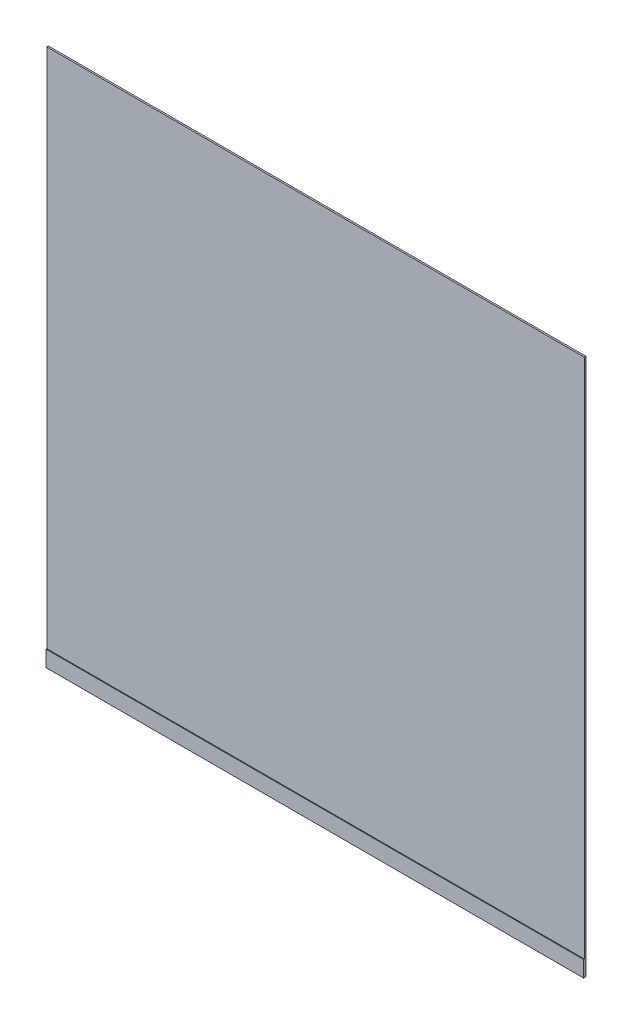
ISO-10303-21;
HEADER;
FILE_DESCRIPTION(('STEP AP214'),'2;1');
FILE_NAME('part.step','',(''),(''),'','','');
FILE_SCHEMA(('AUTOMOTIVE_DESIGN { 1 0 10303 214 1 1 1 1 }'));
ENDSEC;
DATA;
#1=APPLICATION_CONTEXT('core data for automotive mechanical design processes');
#2=APPLICATION_PROTOCOL_DEFINITION('international standard','automotive_design',2000,#1);
#3=PRODUCT_CONTEXT('',#1,'mechanical');
#4=PRODUCT('Part','Part','',(#3));
#5=PRODUCT_RELATED_PRODUCT_CATEGORY('part','',(#4));
#6=PRODUCT_DEFINITION_FORMATION('','',#4);
#7=PRODUCT_DEFINITION_CONTEXT('part definition',#1,'design');
#8=PRODUCT_DEFINITION('design','',#6,#7);
#9=PRODUCT_DEFINITION_SHAPE('','',#8);
#10=(LENGTH_UNIT() NAMED_UNIT(*) SI_UNIT(.MILLI.,.METRE.));
#11=(NAMED_UNIT(*) PLANE_ANGLE_UNIT() SI_UNIT($,.RADIAN.));
#12=(NAMED_UNIT(*) SI_UNIT($,.STERADIAN.) SOLID_ANGLE_UNIT());
#13=UNCERTAINTY_MEASURE_WITH_UNIT(LENGTH_MEASURE(1.E-05),#10,'distance_accuracy_value','');
#14=(GEOMETRIC_REPRESENTATION_CONTEXT(3) GLOBAL_UNCERTAINTY_ASSIGNED_CONTEXT((#13)) GLOBAL_UNIT_ASSIGNED_CONTEXT((#10,
#11,#12)) REPRESENTATION_CONTEXT('',''));
#15=CARTESIAN_POINT('',(0.,0.,0.));
#16=DIRECTION('',(0.,0.,1.));
#17=DIRECTION('',(1.,0.,0.));
#18=AXIS2_PLACEMENT_3D('',#15,#16,#17);
#19=CARTESIAN_POINT('',(0.,0.,10.));
#20=DIRECTION('',(0.,0.,-1.));
#21=DIRECTION('',(-1.,0.,0.));
#22=AXIS2_PLACEMENT_3D('',#19,#20,#21);
#23=PLANE('',#22);
#24=DIRECTION('',(-1.,0.,0.));
#25=VECTOR('',#24,1.);
#26=CARTESIAN_POINT('',(-1750.,-1645.26290420658,10.));
#27=LINE('',#26,#25);
#28=CARTESIAN_POINT('',(1750.,-1645.26290420658,10.));
#29=VERTEX_POINT('',#28);
#30=CARTESIAN_POINT('',(-1750.,-1645.26290420658,10.));
#31=VERTEX_POINT('',#30);
#32=EDGE_CURVE('E50',#29,#31,#27,.T.);
#33=ORIENTED_EDGE('',*,*,#32,.F.);
#34=DIRECTION('',(0.,1.,0.));
#35=VECTOR('',#34,1.);
#36=CARTESIAN_POINT('',(1750.,-1750.,10.));
#37=LINE('',#36,#35);
#38=CARTESIAN_POINT('',(1750.,1750.,10.));
#39=VERTEX_POINT('',#38);
#40=EDGE_CURVE('E88',#29,#39,#37,.T.);
#41=ORIENTED_EDGE('',*,*,#40,.T.);
#42=DIRECTION('',(-1.,0.,0.));
#43=VECTOR('',#42,1.);
#44=CARTESIAN_POINT('',(-1750.,1750.,10.));
#45=LINE('',#44,#43);
#46=CARTESIAN_POINT('',(-1750.,1750.,10.));
#47=VERTEX_POINT('',#46);
#48=EDGE_CURVE('E56',#39,#47,#45,.T.);
#49=ORIENTED_EDGE('',*,*,#48,.T.);
#50=DIRECTION('',(0.,-1.,0.));
#51=VECTOR('',#50,1.);
#52=CARTESIAN_POINT('',(-1750.,-1750.,10.));
#53=LINE('',#52,#51);
#54=EDGE_CURVE('E99',#47,#31,#53,.T.);
#55=ORIENTED_EDGE('',*,*,#54,.T.);
#56=EDGE_LOOP('',(#33,#41,#49,#55));
#57=FACE_BOUND('',#56,.T.);
#58=ADVANCED_FACE('F35',(#57),#23,.F.);
#59=CARTESIAN_POINT('',(1750.,-1750.,10.));
#60=DIRECTION('',(-1.,0.,0.));
#61=DIRECTION('',(0.,0.,1.));
#62=AXIS2_PLACEMENT_3D('',#59,#60,#61);
#63=PLANE('',#62);
#64=DIRECTION('',(0.,1.,0.));
#65=VECTOR('',#64,1.);
#66=CARTESIAN_POINT('',(1750.,-1750.,0.));
#67=LINE('',#66,#65);
#68=CARTESIAN_POINT('',(1750.,-1750.,0.));
#69=VERTEX_POINT('',#68);
#70=CARTESIAN_POINT('',(1750.,1750.,0.));
#71=VERTEX_POINT('',#70);
#72=EDGE_CURVE('E95',#69,#71,#67,.T.);
#73=ORIENTED_EDGE('',*,*,#72,.T.);
#74=DIRECTION('',(0.,0.,-1.));
#75=VECTOR('',#74,1.);
#76=CARTESIAN_POINT('',(1750.,1750.,10.));
#77=LINE('',#76,#75);
#78=EDGE_CURVE('E11',#39,#71,#77,.T.);
#79=ORIENTED_EDGE('',*,*,#78,.F.);
#80=ORIENTED_EDGE('',*,*,#40,.F.);
#81=DIRECTION('',(0.,0.,-1.));
#82=VECTOR('',#81,1.);
#83=CARTESIAN_POINT('',(1750.,-1645.26290420658,15.));
#84=LINE('',#83,#82);
#85=CARTESIAN_POINT('',(1750.,-1645.26290420658,15.));
#86=VERTEX_POINT('',#85);
#87=EDGE_CURVE('E103',#86,#29,#84,.T.);
#88=ORIENTED_EDGE('',*,*,#87,.F.);
#89=DIRECTION('',(0.,1.,0.));
#90=VECTOR('',#89,1.);
#91=CARTESIAN_POINT('',(1750.,-1750.,15.));
#92=LINE('',#91,#90);
#93=CARTESIAN_POINT('',(1750.,-1750.,15.));
#94=VERTEX_POINT('',#93);
#95=EDGE_CURVE('E98',#94,#86,#92,.T.);
#96=ORIENTED_EDGE('',*,*,#95,.F.);
#97=DIRECTION('',(0.,0.,-1.));
#98=VECTOR('',#97,1.);
#99=CARTESIAN_POINT('',(1750.,-1750.,10.));
#100=LINE('',#99,#98);
#101=EDGE_CURVE('E81',#94,#69,#100,.T.);
#102=ORIENTED_EDGE('',*,*,#101,.T.);
#103=EDGE_LOOP('',(#73,#79,#80,#88,#96,#102));
#104=FACE_BOUND('',#103,.T.);
#105=ADVANCED_FACE('F37',(#104),#63,.F.);
#106=CARTESIAN_POINT('',(-1750.,1750.,10.));
#107=DIRECTION('',(0.,-1.,0.));
#108=DIRECTION('',(0.,0.,-1.));
#109=AXIS2_PLACEMENT_3D('',#106,#107,#108);
#110=PLANE('',#109);
#111=DIRECTION('',(-1.,0.,0.));
#112=VECTOR('',#111,1.);
#113=CARTESIAN_POINT('',(-1750.,1750.,0.));
#114=LINE('',#113,#112);
#115=CARTESIAN_POINT('',(-1750.,1750.,0.));
#116=VERTEX_POINT('',#115);
#117=EDGE_CURVE('E102',#71,#116,#114,.T.);
#118=ORIENTED_EDGE('',*,*,#117,.T.);
#119=DIRECTION('',(0.,0.,-1.));
#120=VECTOR('',#119,1.);
#121=CARTESIAN_POINT('',(-1750.,1750.,10.));
#122=LINE('',#121,#120);
#123=EDGE_CURVE('E43',#47,#116,#122,.T.);
#124=ORIENTED_EDGE('',*,*,#123,.F.);
#125=ORIENTED_EDGE('',*,*,#48,.F.);
#126=ORIENTED_EDGE('',*,*,#78,.T.);
#127=EDGE_LOOP('',(#118,#124,#125,#126));
#128=FACE_BOUND('',#127,.T.);
#129=ADVANCED_FACE('F119',(#128),#110,.F.);
#130=CARTESIAN_POINT('',(-1750.,-1750.,10.));
#131=DIRECTION('',(1.,0.,0.));
#132=DIRECTION('',(0.,0.,-1.));
#133=AXIS2_PLACEMENT_3D('',#130,#131,#132);
#134=PLANE('',#133);
#135=DIRECTION('',(0.,-1.,0.));
#136=VECTOR('',#135,1.);
#137=CARTESIAN_POINT('',(-1750.,-1750.,0.));
#138=LINE('',#137,#136);
#139=CARTESIAN_POINT('',(-1750.,-1750.,0.));
#140=VERTEX_POINT('',#139);
#141=EDGE_CURVE('E89',#116,#140,#138,.T.);
#142=ORIENTED_EDGE('',*,*,#141,.T.);
#143=DIRECTION('',(0.,0.,-1.));
#144=VECTOR('',#143,1.);
#145=CARTESIAN_POINT('',(-1750.,-1750.,10.));
#146=LINE('',#145,#144);
#147=CARTESIAN_POINT('',(-1750.,-1750.,15.));
#148=VERTEX_POINT('',#147);
#149=EDGE_CURVE('E84',#148,#140,#146,.T.);
#150=ORIENTED_EDGE('',*,*,#149,.F.);
#151=DIRECTION('',(0.,-1.,0.));
#152=VECTOR('',#151,1.);
#153=CARTESIAN_POINT('',(-1750.,-1750.,15.));
#154=LINE('',#153,#152);
#155=CARTESIAN_POINT('',(-1750.,-1645.26290420658,15.));
#156=VERTEX_POINT('',#155);
#157=EDGE_CURVE('E139',#156,#148,#154,.T.);
#158=ORIENTED_EDGE('',*,*,#157,.F.);
#159=DIRECTION('',(0.,0.,-1.));
#160=VECTOR('',#159,1.);
#161=CARTESIAN_POINT('',(-1750.,-1645.26290420658,15.));
#162=LINE('',#161,#160);
#163=EDGE_CURVE('E107',#156,#31,#162,.T.);
#164=ORIENTED_EDGE('',*,*,#163,.T.);
#165=ORIENTED_EDGE('',*,*,#54,.F.);
#166=ORIENTED_EDGE('',*,*,#123,.T.);
#167=EDGE_LOOP('',(#142,#150,#158,#164,#165,#166));
#168=FACE_BOUND('',#167,.T.);
#169=ADVANCED_FACE('F116',(#168),#134,.F.);
#170=CARTESIAN_POINT('',(-1750.,-1750.,10.));
#171=DIRECTION('',(0.,1.,0.));
#172=DIRECTION('',(0.,0.,1.));
#173=AXIS2_PLACEMENT_3D('',#170,#171,#172);
#174=PLANE('',#173);
#175=DIRECTION('',(1.,0.,0.));
#176=VECTOR('',#175,1.);
#177=CARTESIAN_POINT('',(-1750.,-1750.,0.));
#178=LINE('',#177,#176);
#179=EDGE_CURVE('E76',#140,#69,#178,.T.);
#180=ORIENTED_EDGE('',*,*,#179,.T.);
#181=ORIENTED_EDGE('',*,*,#101,.F.);
#182=DIRECTION('',(1.,0.,0.));
#183=VECTOR('',#182,1.);
#184=CARTESIAN_POINT('',(-1750.,-1750.,15.));
#185=LINE('',#184,#183);
#186=EDGE_CURVE('E135',#148,#94,#185,.T.);
#187=ORIENTED_EDGE('',*,*,#186,.F.);
#188=ORIENTED_EDGE('',*,*,#149,.T.);
#189=EDGE_LOOP('',(#180,#181,#187,#188));
#190=FACE_BOUND('',#189,.T.);
#191=ADVANCED_FACE('F78',(#190),#174,.F.);
#192=CARTESIAN_POINT('',(0.,0.,0.));
#193=DIRECTION('',(0.,0.,-1.));
#194=DIRECTION('',(-1.,0.,0.));
#195=AXIS2_PLACEMENT_3D('',#192,#193,#194);
#196=PLANE('',#195);
#197=ORIENTED_EDGE('',*,*,#72,.F.);
#198=ORIENTED_EDGE('',*,*,#179,.F.);
#199=ORIENTED_EDGE('',*,*,#141,.F.);
#200=ORIENTED_EDGE('',*,*,#117,.F.);
#201=EDGE_LOOP('',(#197,#198,#199,#200));
#202=FACE_BOUND('',#201,.T.);
#203=ADVANCED_FACE('F101',(#202),#196,.T.);
#204=CARTESIAN_POINT('',(-1750.,-1645.26290420658,15.));
#205=DIRECTION('',(0.,-1.,0.));
#206=DIRECTION('',(0.,0.,-1.));
#207=AXIS2_PLACEMENT_3D('',#204,#205,#206);
#208=PLANE('',#207);
#209=ORIENTED_EDGE('',*,*,#32,.T.);
#210=ORIENTED_EDGE('',*,*,#163,.F.);
#211=DIRECTION('',(-1.,0.,0.));
#212=VECTOR('',#211,1.);
#213=CARTESIAN_POINT('',(-1750.,-1645.26290420658,15.));
#214=LINE('',#213,#212);
#215=EDGE_CURVE('E128',#86,#156,#214,.T.);
#216=ORIENTED_EDGE('',*,*,#215,.F.);
#217=ORIENTED_EDGE('',*,*,#87,.T.);
#218=EDGE_LOOP('',(#209,#210,#216,#217));
#219=FACE_BOUND('',#218,.T.);
#220=ADVANCED_FACE('F124',(#219),#208,.F.);
#221=CARTESIAN_POINT('',(0.,0.,15.));
#222=DIRECTION('',(0.,0.,-1.));
#223=DIRECTION('',(-1.,0.,0.));
#224=AXIS2_PLACEMENT_3D('',#221,#222,#223);
#225=PLANE('',#224);
#226=ORIENTED_EDGE('',*,*,#157,.T.);
#227=ORIENTED_EDGE('',*,*,#186,.T.);
#228=ORIENTED_EDGE('',*,*,#95,.T.);
#229=ORIENTED_EDGE('',*,*,#215,.T.);
#230=EDGE_LOOP('',(#226,#227,#228,#229));
#231=FACE_BOUND('',#230,.T.);
#232=ADVANCED_FACE('F144',(#231),#225,.F.);
#233=CLOSED_SHELL('',(#58,#105,#129,#169,#191,#203,#220,#232));
#234=MANIFOLD_SOLID_BREP('B2',#233);
#235=ADVANCED_BREP_SHAPE_REPRESENTATION('',(#18,#234),#14);
#236=SHAPE_DEFINITION_REPRESENTATION(#9,#235);
ENDSEC;
END-ISO-10303-21;
